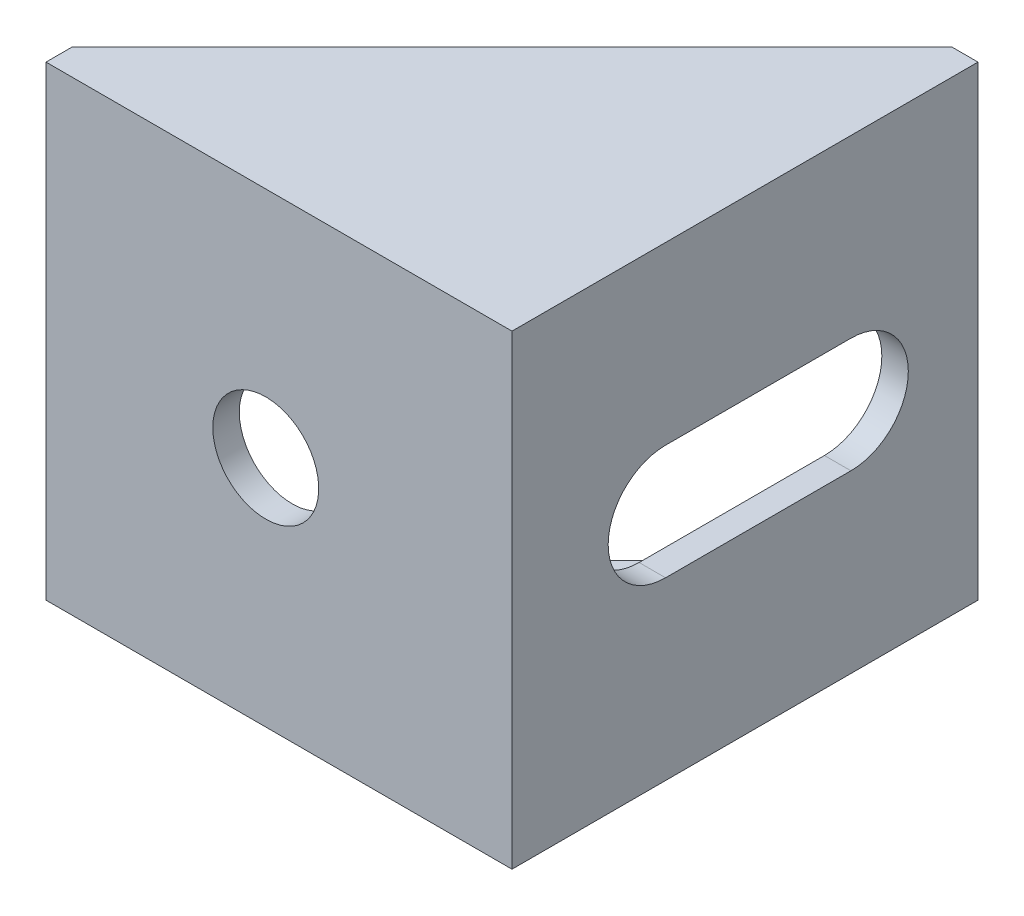
ISO-10303-21;
HEADER;
FILE_DESCRIPTION(('STEP AP214'),'2;1');
FILE_NAME('part.step','',(''),(''),'','','');
FILE_SCHEMA(('AUTOMOTIVE_DESIGN { 1 0 10303 214 1 1 1 1 }'));
ENDSEC;
DATA;
#1=APPLICATION_CONTEXT('core data for automotive mechanical design processes');
#2=APPLICATION_PROTOCOL_DEFINITION('international standard','automotive_design',2000,#1);
#3=PRODUCT_CONTEXT('',#1,'mechanical');
#4=PRODUCT('Part','Part','',(#3));
#5=PRODUCT_RELATED_PRODUCT_CATEGORY('part','',(#4));
#6=PRODUCT_DEFINITION_FORMATION('','',#4);
#7=PRODUCT_DEFINITION_CONTEXT('part definition',#1,'design');
#8=PRODUCT_DEFINITION('design','',#6,#7);
#9=PRODUCT_DEFINITION_SHAPE('','',#8);
#10=(LENGTH_UNIT() NAMED_UNIT(*) SI_UNIT(.MILLI.,.METRE.));
#11=(NAMED_UNIT(*) PLANE_ANGLE_UNIT() SI_UNIT($,.RADIAN.));
#12=(NAMED_UNIT(*) SI_UNIT($,.STERADIAN.) SOLID_ANGLE_UNIT());
#13=UNCERTAINTY_MEASURE_WITH_UNIT(LENGTH_MEASURE(1.E-05),#10,'distance_accuracy_value','');
#14=(GEOMETRIC_REPRESENTATION_CONTEXT(3) GLOBAL_UNCERTAINTY_ASSIGNED_CONTEXT((#13)) GLOBAL_UNIT_ASSIGNED_CONTEXT((#10,
#11,#12)) REPRESENTATION_CONTEXT('',''));
#15=CARTESIAN_POINT('',(0.,0.,0.));
#16=DIRECTION('',(0.,0.,1.));
#17=DIRECTION('',(1.,0.,0.));
#18=AXIS2_PLACEMENT_3D('',#15,#16,#17);
#19=CARTESIAN_POINT('',(0.,25.4,0.));
#20=DIRECTION('',(-1.,0.,0.));
#21=DIRECTION('',(0.,0.,1.));
#22=AXIS2_PLACEMENT_3D('',#19,#20,#21);
#23=PLANE('',#22);
#24=DIRECTION('',(0.,0.,-1.));
#25=VECTOR('',#24,1.);
#26=CARTESIAN_POINT('',(0.,16.1417,-20.32));
#27=LINE('',#26,#25);
#28=CARTESIAN_POINT('',(0.,16.1417,-9.2075));
#29=VERTEX_POINT('',#28);
#30=CARTESIAN_POINT('',(0.,16.1417,-20.32));
#31=VERTEX_POINT('',#30);
#32=EDGE_CURVE('E128',#29,#31,#27,.T.);
#33=ORIENTED_EDGE('',*,*,#32,.T.);
#34=CARTESIAN_POINT('',(0.,12.7,-20.32));
#35=DIRECTION('',(-1.,0.,0.));
#36=DIRECTION('',(0.,0.,-1.));
#37=AXIS2_PLACEMENT_3D('',#34,#35,#36);
#38=CIRCLE('',#37,3.4417);
#39=CARTESIAN_POINT('',(0.,9.2583,-20.32));
#40=VERTEX_POINT('',#39);
#41=EDGE_CURVE('E122',#31,#40,#38,.T.);
#42=ORIENTED_EDGE('',*,*,#41,.T.);
#43=DIRECTION('',(0.,0.,1.));
#44=VECTOR('',#43,1.);
#45=CARTESIAN_POINT('',(0.,9.2583,-20.32));
#46=LINE('',#45,#44);
#47=CARTESIAN_POINT('',(0.,9.2583,-9.2075));
#48=VERTEX_POINT('',#47);
#49=EDGE_CURVE('E131',#40,#48,#46,.T.);
#50=ORIENTED_EDGE('',*,*,#49,.T.);
#51=CARTESIAN_POINT('',(0.,12.7,-9.2075));
#52=DIRECTION('',(-1.,0.,0.));
#53=DIRECTION('',(0.,0.,1.));
#54=AXIS2_PLACEMENT_3D('',#51,#52,#53);
#55=CIRCLE('',#54,3.4417);
#56=EDGE_CURVE('E47',#48,#29,#55,.T.);
#57=ORIENTED_EDGE('',*,*,#56,.T.);
#58=EDGE_LOOP('',(#33,#42,#50,#57));
#59=FACE_BOUND('',#58,.T.);
#60=DIRECTION('',(0.,-1.,0.));
#61=VECTOR('',#60,1.);
#62=CARTESIAN_POINT('',(0.,25.4,0.));
#63=LINE('',#62,#61);
#64=CARTESIAN_POINT('',(0.,26.67,0.));
#65=VERTEX_POINT('',#64);
#66=CARTESIAN_POINT('',(0.,-1.27,0.));
#67=VERTEX_POINT('',#66);
#68=EDGE_CURVE('E213',#65,#67,#63,.T.);
#69=ORIENTED_EDGE('',*,*,#68,.T.);
#70=DIRECTION('',(0.,0.,1.));
#71=VECTOR('',#70,1.);
#72=CARTESIAN_POINT('',(0.,-1.27,-27.94));
#73=LINE('',#72,#71);
#74=CARTESIAN_POINT('',(0.,-1.27,-27.94));
#75=VERTEX_POINT('',#74);
#76=EDGE_CURVE('E168',#75,#67,#73,.T.);
#77=ORIENTED_EDGE('',*,*,#76,.F.);
#78=DIRECTION('',(0.,-1.,0.));
#79=VECTOR('',#78,1.);
#80=CARTESIAN_POINT('',(0.,25.4,-27.94));
#81=LINE('',#80,#79);
#82=CARTESIAN_POINT('',(0.,26.67,-27.94));
#83=VERTEX_POINT('',#82);
#84=EDGE_CURVE('E11',#83,#75,#81,.T.);
#85=ORIENTED_EDGE('',*,*,#84,.F.);
#86=DIRECTION('',(0.,0.,-1.));
#87=VECTOR('',#86,1.);
#88=CARTESIAN_POINT('',(0.,26.67,0.));
#89=LINE('',#88,#87);
#90=EDGE_CURVE('E194',#65,#83,#89,.T.);
#91=ORIENTED_EDGE('',*,*,#90,.F.);
#92=EDGE_LOOP('',(#69,#77,#85,#91));
#93=FACE_BOUND('',#92,.T.);
#94=ADVANCED_FACE('F33',(#59,#93),#23,.F.);
#95=CARTESIAN_POINT('',(0.,25.4,-27.94));
#96=DIRECTION('',(0.,0.,1.));
#97=DIRECTION('',(1.,0.,0.));
#98=AXIS2_PLACEMENT_3D('',#95,#96,#97);
#99=PLANE('',#98);
#100=ORIENTED_EDGE('',*,*,#84,.T.);
#101=DIRECTION('',(1.,0.,0.));
#102=VECTOR('',#101,1.);
#103=CARTESIAN_POINT('',(-1.5875,-1.27,-27.94));
#104=LINE('',#103,#102);
#105=CARTESIAN_POINT('',(-1.5875,-1.27,-27.94));
#106=VERTEX_POINT('',#105);
#107=EDGE_CURVE('E165',#106,#75,#104,.T.);
#108=ORIENTED_EDGE('',*,*,#107,.F.);
#109=DIRECTION('',(0.,1.,0.));
#110=VECTOR('',#109,1.);
#111=CARTESIAN_POINT('',(-1.5875,-1.27,-27.94));
#112=LINE('',#111,#110);
#113=CARTESIAN_POINT('',(-1.5875,0.,-27.94));
#114=VERTEX_POINT('',#113);
#115=EDGE_CURVE('E174',#106,#114,#112,.T.);
#116=ORIENTED_EDGE('',*,*,#115,.T.);
#117=DIRECTION('',(0.,-1.,0.));
#118=VECTOR('',#117,1.);
#119=CARTESIAN_POINT('',(-1.5875,25.4,-27.94));
#120=LINE('',#119,#118);
#121=CARTESIAN_POINT('',(-1.5875,25.4,-27.94));
#122=VERTEX_POINT('',#121);
#123=EDGE_CURVE('E40',#122,#114,#120,.T.);
#124=ORIENTED_EDGE('',*,*,#123,.F.);
#125=DIRECTION('',(0.,-1.,0.));
#126=VECTOR('',#125,1.);
#127=CARTESIAN_POINT('',(-1.5875,26.67,-27.94));
#128=LINE('',#127,#126);
#129=CARTESIAN_POINT('',(-1.5875,26.67,-27.94));
#130=VERTEX_POINT('',#129);
#131=EDGE_CURVE('E202',#130,#122,#128,.T.);
#132=ORIENTED_EDGE('',*,*,#131,.F.);
#133=DIRECTION('',(-1.,0.,0.));
#134=VECTOR('',#133,1.);
#135=CARTESIAN_POINT('',(0.,26.67,-27.94));
#136=LINE('',#135,#134);
#137=EDGE_CURVE('E183',#83,#130,#136,.T.);
#138=ORIENTED_EDGE('',*,*,#137,.F.);
#139=EDGE_LOOP('',(#100,#108,#116,#124,#132,#138));
#140=FACE_BOUND('',#139,.T.);
#141=ADVANCED_FACE('F240',(#140),#99,.F.);
#142=CARTESIAN_POINT('',(-1.5875,25.4,-1.5875));
#143=DIRECTION('',(-1.,0.,0.));
#144=DIRECTION('',(0.,0.,1.));
#145=AXIS2_PLACEMENT_3D('',#142,#143,#144);
#146=PLANE('',#145);
#147=CARTESIAN_POINT('',(-1.5875,12.7,-20.32));
#148=DIRECTION('',(-1.,0.,0.));
#149=DIRECTION('',(0.,0.,-1.));
#150=AXIS2_PLACEMENT_3D('',#147,#148,#149);
#151=CIRCLE('',#150,3.4417);
#152=CARTESIAN_POINT('',(-1.5875,16.1417,-20.32));
#153=VERTEX_POINT('',#152);
#154=CARTESIAN_POINT('',(-1.5875,9.2583,-20.32));
#155=VERTEX_POINT('',#154);
#156=EDGE_CURVE('E55',#153,#155,#151,.T.);
#157=ORIENTED_EDGE('',*,*,#156,.F.);
#158=DIRECTION('',(0.,0.,-1.));
#159=VECTOR('',#158,1.);
#160=CARTESIAN_POINT('',(-1.5875,16.1417,-20.32));
#161=LINE('',#160,#159);
#162=CARTESIAN_POINT('',(-1.5875,16.1417,-9.2075));
#163=VERTEX_POINT('',#162);
#164=EDGE_CURVE('E137',#163,#153,#161,.T.);
#165=ORIENTED_EDGE('',*,*,#164,.F.);
#166=CARTESIAN_POINT('',(-1.5875,12.7,-9.2075));
#167=DIRECTION('',(-1.,0.,0.));
#168=DIRECTION('',(0.,0.,1.));
#169=AXIS2_PLACEMENT_3D('',#166,#167,#168);
#170=CIRCLE('',#169,3.4417);
#171=CARTESIAN_POINT('',(-1.5875,9.2583,-9.2075));
#172=VERTEX_POINT('',#171);
#173=EDGE_CURVE('E140',#172,#163,#170,.T.);
#174=ORIENTED_EDGE('',*,*,#173,.F.);
#175=DIRECTION('',(0.,0.,1.));
#176=VECTOR('',#175,1.);
#177=CARTESIAN_POINT('',(-1.5875,9.2583,-20.32));
#178=LINE('',#177,#176);
#179=EDGE_CURVE('E149',#155,#172,#178,.T.);
#180=ORIENTED_EDGE('',*,*,#179,.F.);
#181=EDGE_LOOP('',(#157,#165,#174,#180));
#182=FACE_BOUND('',#181,.T.);
#183=DIRECTION('',(0.,0.,-1.));
#184=VECTOR('',#183,1.);
#185=CARTESIAN_POINT('',(-1.5875,0.,-1.5875));
#186=LINE('',#185,#184);
#187=CARTESIAN_POINT('',(-1.5875,0.,-1.5875));
#188=VERTEX_POINT('',#187);
#189=EDGE_CURVE('E205',#188,#114,#186,.T.);
#190=ORIENTED_EDGE('',*,*,#189,.F.);
#191=DIRECTION('',(0.,-1.,0.));
#192=VECTOR('',#191,1.);
#193=CARTESIAN_POINT('',(-1.5875,25.4,-1.5875));
#194=LINE('',#193,#192);
#195=CARTESIAN_POINT('',(-1.5875,25.4,-1.5875));
#196=VERTEX_POINT('',#195);
#197=EDGE_CURVE('E223',#196,#188,#194,.T.);
#198=ORIENTED_EDGE('',*,*,#197,.F.);
#199=DIRECTION('',(0.,0.,-1.));
#200=VECTOR('',#199,1.);
#201=CARTESIAN_POINT('',(-1.5875,25.4,-1.5875));
#202=LINE('',#201,#200);
#203=EDGE_CURVE('E206',#196,#122,#202,.T.);
#204=ORIENTED_EDGE('',*,*,#203,.T.);
#205=ORIENTED_EDGE('',*,*,#123,.T.);
#206=EDGE_LOOP('',(#190,#198,#204,#205));
#207=FACE_BOUND('',#206,.T.);
#208=ADVANCED_FACE('F227',(#182,#207),#146,.T.);
#209=CARTESIAN_POINT('',(-27.94,25.4,-1.5875));
#210=DIRECTION('',(0.,0.,-1.));
#211=DIRECTION('',(-1.,0.,0.));
#212=AXIS2_PLACEMENT_3D('',#209,#210,#211);
#213=PLANE('',#212);
#214=CARTESIAN_POINT('',(-14.76375,12.7,-1.5875));
#215=DIRECTION('',(0.,0.,-1.));
#216=DIRECTION('',(-1.,0.,0.));
#217=AXIS2_PLACEMENT_3D('',#214,#215,#216);
#218=CIRCLE('',#217,3.175);
#219=CARTESIAN_POINT('',(-17.93875,12.7,-1.5875));
#220=VERTEX_POINT('',#219);
#221=EDGE_CURVE('E143',#220,#220,#218,.T.);
#222=ORIENTED_EDGE('',*,*,#221,.F.);
#223=EDGE_LOOP('',(#222));
#224=FACE_BOUND('',#223,.T.);
#225=DIRECTION('',(1.,0.,0.));
#226=VECTOR('',#225,1.);
#227=CARTESIAN_POINT('',(-27.94,0.,-1.5875));
#228=LINE('',#227,#226);
#229=CARTESIAN_POINT('',(-27.94,0.,-1.5875));
#230=VERTEX_POINT('',#229);
#231=EDGE_CURVE('E210',#230,#188,#228,.T.);
#232=ORIENTED_EDGE('',*,*,#231,.F.);
#233=DIRECTION('',(0.,-1.,0.));
#234=VECTOR('',#233,1.);
#235=CARTESIAN_POINT('',(-27.94,25.4,-1.5875));
#236=LINE('',#235,#234);
#237=CARTESIAN_POINT('',(-27.94,25.4,-1.5875));
#238=VERTEX_POINT('',#237);
#239=EDGE_CURVE('E221',#238,#230,#236,.T.);
#240=ORIENTED_EDGE('',*,*,#239,.F.);
#241=DIRECTION('',(1.,0.,0.));
#242=VECTOR('',#241,1.);
#243=CARTESIAN_POINT('',(-27.94,25.4,-1.5875));
#244=LINE('',#243,#242);
#245=EDGE_CURVE('E209',#238,#196,#244,.T.);
#246=ORIENTED_EDGE('',*,*,#245,.T.);
#247=ORIENTED_EDGE('',*,*,#197,.T.);
#248=EDGE_LOOP('',(#232,#240,#246,#247));
#249=FACE_BOUND('',#248,.T.);
#250=ADVANCED_FACE('F259',(#224,#249),#213,.T.);
#251=CARTESIAN_POINT('',(-27.94,25.4,0.));
#252=DIRECTION('',(-1.,0.,0.));
#253=DIRECTION('',(0.,0.,1.));
#254=AXIS2_PLACEMENT_3D('',#251,#252,#253);
#255=PLANE('',#254);
#256=ORIENTED_EDGE('',*,*,#239,.T.);
#257=DIRECTION('',(0.,1.,0.));
#258=VECTOR('',#257,1.);
#259=CARTESIAN_POINT('',(-27.94,-1.27,-1.5875));
#260=LINE('',#259,#258);
#261=CARTESIAN_POINT('',(-27.94,-1.27,-1.5875));
#262=VERTEX_POINT('',#261);
#263=EDGE_CURVE('E179',#262,#230,#260,.T.);
#264=ORIENTED_EDGE('',*,*,#263,.F.);
#265=DIRECTION('',(0.,0.,-1.));
#266=VECTOR('',#265,1.);
#267=CARTESIAN_POINT('',(-27.94,-1.27,0.));
#268=LINE('',#267,#266);
#269=CARTESIAN_POINT('',(-27.94,-1.27,0.));
#270=VERTEX_POINT('',#269);
#271=EDGE_CURVE('E160',#270,#262,#268,.T.);
#272=ORIENTED_EDGE('',*,*,#271,.F.);
#273=DIRECTION('',(0.,-1.,0.));
#274=VECTOR('',#273,1.);
#275=CARTESIAN_POINT('',(-27.94,25.4,0.));
#276=LINE('',#275,#274);
#277=CARTESIAN_POINT('',(-27.94,26.67,0.));
#278=VERTEX_POINT('',#277);
#279=EDGE_CURVE('E219',#278,#270,#276,.T.);
#280=ORIENTED_EDGE('',*,*,#279,.F.);
#281=DIRECTION('',(0.,0.,1.));
#282=VECTOR('',#281,1.);
#283=CARTESIAN_POINT('',(-27.94,26.67,-1.5875));
#284=LINE('',#283,#282);
#285=CARTESIAN_POINT('',(-27.94,26.67,-1.5875));
#286=VERTEX_POINT('',#285);
#287=EDGE_CURVE('E188',#286,#278,#284,.T.);
#288=ORIENTED_EDGE('',*,*,#287,.F.);
#289=DIRECTION('',(0.,-1.,0.));
#290=VECTOR('',#289,1.);
#291=CARTESIAN_POINT('',(-27.94,26.67,-1.5875));
#292=LINE('',#291,#290);
#293=EDGE_CURVE('E197',#286,#238,#292,.T.);
#294=ORIENTED_EDGE('',*,*,#293,.T.);
#295=EDGE_LOOP('',(#256,#264,#272,#280,#288,#294));
#296=FACE_BOUND('',#295,.T.);
#297=ADVANCED_FACE('F255',(#296),#255,.T.);
#298=CARTESIAN_POINT('',(0.,25.4,0.));
#299=DIRECTION('',(0.,0.,1.));
#300=DIRECTION('',(1.,0.,0.));
#301=AXIS2_PLACEMENT_3D('',#298,#299,#300);
#302=PLANE('',#301);
#303=CARTESIAN_POINT('',(-14.76375,12.7,0.));
#304=DIRECTION('',(0.,0.,-1.));
#305=DIRECTION('',(-1.,0.,0.));
#306=AXIS2_PLACEMENT_3D('',#303,#304,#305);
#307=CIRCLE('',#306,3.175);
#308=CARTESIAN_POINT('',(-17.93875,12.7,0.));
#309=VERTEX_POINT('',#308);
#310=EDGE_CURVE('E150',#309,#309,#307,.T.);
#311=ORIENTED_EDGE('',*,*,#310,.T.);
#312=EDGE_LOOP('',(#311));
#313=FACE_BOUND('',#312,.T.);
#314=ORIENTED_EDGE('',*,*,#279,.T.);
#315=DIRECTION('',(-1.,0.,0.));
#316=VECTOR('',#315,1.);
#317=CARTESIAN_POINT('',(0.,-1.27,0.));
#318=LINE('',#317,#316);
#319=EDGE_CURVE('E171',#67,#270,#318,.T.);
#320=ORIENTED_EDGE('',*,*,#319,.F.);
#321=ORIENTED_EDGE('',*,*,#68,.F.);
#322=DIRECTION('',(1.,0.,0.));
#323=VECTOR('',#322,1.);
#324=CARTESIAN_POINT('',(-27.94,26.67,0.));
#325=LINE('',#324,#323);
#326=EDGE_CURVE('E191',#278,#65,#325,.T.);
#327=ORIENTED_EDGE('',*,*,#326,.F.);
#328=EDGE_LOOP('',(#314,#320,#321,#327));
#329=FACE_BOUND('',#328,.T.);
#330=ADVANCED_FACE('F249',(#313,#329),#302,.T.);
#331=CARTESIAN_POINT('',(-1.5875,26.67,-27.94));
#332=DIRECTION('',(0.707106781186548,0.,0.707106781186547));
#333=DIRECTION('',(0.707106781186547,0.,-0.707106781186548));
#334=AXIS2_PLACEMENT_3D('',#331,#332,#333);
#335=PLANE('',#334);
#336=DIRECTION('',(-0.707106781186547,0.,0.707106781186548));
#337=VECTOR('',#336,1.);
#338=CARTESIAN_POINT('',(-1.5875,25.4,-27.94));
#339=LINE('',#338,#337);
#340=EDGE_CURVE('E182',#122,#238,#339,.T.);
#341=ORIENTED_EDGE('',*,*,#340,.T.);
#342=ORIENTED_EDGE('',*,*,#293,.F.);
#343=DIRECTION('',(-0.707106781186547,0.,0.707106781186548));
#344=VECTOR('',#343,1.);
#345=CARTESIAN_POINT('',(-1.5875,26.67,-27.94));
#346=LINE('',#345,#344);
#347=EDGE_CURVE('E186',#130,#286,#346,.T.);
#348=ORIENTED_EDGE('',*,*,#347,.F.);
#349=ORIENTED_EDGE('',*,*,#131,.T.);
#350=EDGE_LOOP('',(#341,#342,#348,#349));
#351=FACE_BOUND('',#350,.T.);
#352=ADVANCED_FACE('F263',(#351),#335,.F.);
#353=CARTESIAN_POINT('',(0.,26.67,0.));
#354=DIRECTION('',(0.,1.,0.));
#355=DIRECTION('',(0.,0.,1.));
#356=AXIS2_PLACEMENT_3D('',#353,#354,#355);
#357=PLANE('',#356);
#358=ORIENTED_EDGE('',*,*,#137,.T.);
#359=ORIENTED_EDGE('',*,*,#347,.T.);
#360=ORIENTED_EDGE('',*,*,#287,.T.);
#361=ORIENTED_EDGE('',*,*,#326,.T.);
#362=ORIENTED_EDGE('',*,*,#90,.T.);
#363=EDGE_LOOP('',(#358,#359,#360,#361,#362));
#364=FACE_BOUND('',#363,.T.);
#365=ADVANCED_FACE('F251',(#364),#357,.T.);
#366=CARTESIAN_POINT('',(0.,25.4,0.));
#367=DIRECTION('',(0.,1.,0.));
#368=DIRECTION('',(0.,0.,1.));
#369=AXIS2_PLACEMENT_3D('',#366,#367,#368);
#370=PLANE('',#369);
#371=ORIENTED_EDGE('',*,*,#203,.F.);
#372=ORIENTED_EDGE('',*,*,#245,.F.);
#373=ORIENTED_EDGE('',*,*,#340,.F.);
#374=EDGE_LOOP('',(#371,#372,#373));
#375=FACE_BOUND('',#374,.T.);
#376=ADVANCED_FACE('F261',(#375),#370,.F.);
#377=CARTESIAN_POINT('',(0.,0.,0.));
#378=DIRECTION('',(0.,-1.,0.));
#379=DIRECTION('',(0.,0.,-1.));
#380=AXIS2_PLACEMENT_3D('',#377,#378,#379);
#381=PLANE('',#380);
#382=DIRECTION('',(0.707106781186547,0.,-0.707106781186548));
#383=VECTOR('',#382,1.);
#384=CARTESIAN_POINT('',(-27.94,0.,-1.5875));
#385=LINE('',#384,#383);
#386=EDGE_CURVE('E156',#230,#114,#385,.T.);
#387=ORIENTED_EDGE('',*,*,#386,.F.);
#388=ORIENTED_EDGE('',*,*,#231,.T.);
#389=ORIENTED_EDGE('',*,*,#189,.T.);
#390=EDGE_LOOP('',(#387,#388,#389));
#391=FACE_BOUND('',#390,.T.);
#392=ADVANCED_FACE('F233',(#391),#381,.F.);
#393=CARTESIAN_POINT('',(-27.94,-1.27,-1.5875));
#394=DIRECTION('',(0.707106781186548,0.,0.707106781186547));
#395=DIRECTION('',(0.707106781186547,0.,-0.707106781186548));
#396=AXIS2_PLACEMENT_3D('',#393,#394,#395);
#397=PLANE('',#396);
#398=ORIENTED_EDGE('',*,*,#386,.T.);
#399=ORIENTED_EDGE('',*,*,#115,.F.);
#400=DIRECTION('',(0.707106781186547,0.,-0.707106781186548));
#401=VECTOR('',#400,1.);
#402=CARTESIAN_POINT('',(-27.94,-1.27,-1.5875));
#403=LINE('',#402,#401);
#404=EDGE_CURVE('E163',#262,#106,#403,.T.);
#405=ORIENTED_EDGE('',*,*,#404,.F.);
#406=ORIENTED_EDGE('',*,*,#263,.T.);
#407=EDGE_LOOP('',(#398,#399,#405,#406));
#408=FACE_BOUND('',#407,.T.);
#409=ADVANCED_FACE('F237',(#408),#397,.F.);
#410=CARTESIAN_POINT('',(0.,-1.27,0.));
#411=DIRECTION('',(0.,-1.,0.));
#412=DIRECTION('',(0.,0.,-1.));
#413=AXIS2_PLACEMENT_3D('',#410,#411,#412);
#414=PLANE('',#413);
#415=ORIENTED_EDGE('',*,*,#271,.T.);
#416=ORIENTED_EDGE('',*,*,#404,.T.);
#417=ORIENTED_EDGE('',*,*,#107,.T.);
#418=ORIENTED_EDGE('',*,*,#76,.T.);
#419=ORIENTED_EDGE('',*,*,#319,.T.);
#420=EDGE_LOOP('',(#415,#416,#417,#418,#419));
#421=FACE_BOUND('',#420,.T.);
#422=ADVANCED_FACE('F244',(#421),#414,.T.);
#423=CARTESIAN_POINT('',(0.,12.7,-20.32));
#424=DIRECTION('',(-1.,0.,0.));
#425=DIRECTION('',(0.,0.,1.));
#426=AXIS2_PLACEMENT_3D('',#423,#424,#425);
#427=CYLINDRICAL_SURFACE('',#426,3.4417);
#428=ORIENTED_EDGE('',*,*,#156,.T.);
#429=DIRECTION('',(-1.,0.,0.));
#430=VECTOR('',#429,1.);
#431=CARTESIAN_POINT('',(0.,9.2583,-20.32));
#432=LINE('',#431,#430);
#433=EDGE_CURVE('E118',#40,#155,#432,.T.);
#434=ORIENTED_EDGE('',*,*,#433,.F.);
#435=ORIENTED_EDGE('',*,*,#41,.F.);
#436=DIRECTION('',(-1.,0.,0.));
#437=VECTOR('',#436,1.);
#438=CARTESIAN_POINT('',(0.,16.1417,-20.32));
#439=LINE('',#438,#437);
#440=EDGE_CURVE('E154',#31,#153,#439,.T.);
#441=ORIENTED_EDGE('',*,*,#440,.T.);
#442=EDGE_LOOP('',(#428,#434,#435,#441));
#443=FACE_BOUND('',#442,.T.);
#444=ADVANCED_FACE('F120',(#443),#427,.F.);
#445=CARTESIAN_POINT('',(0.,16.1417,-20.32));
#446=DIRECTION('',(0.,1.,0.));
#447=DIRECTION('',(0.,0.,1.));
#448=AXIS2_PLACEMENT_3D('',#445,#446,#447);
#449=PLANE('',#448);
#450=ORIENTED_EDGE('',*,*,#164,.T.);
#451=ORIENTED_EDGE('',*,*,#440,.F.);
#452=ORIENTED_EDGE('',*,*,#32,.F.);
#453=DIRECTION('',(-1.,0.,0.));
#454=VECTOR('',#453,1.);
#455=CARTESIAN_POINT('',(0.,16.1417,-9.2075));
#456=LINE('',#455,#454);
#457=EDGE_CURVE('E157',#29,#163,#456,.T.);
#458=ORIENTED_EDGE('',*,*,#457,.T.);
#459=EDGE_LOOP('',(#450,#451,#452,#458));
#460=FACE_BOUND('',#459,.T.);
#461=ADVANCED_FACE('F326',(#460),#449,.F.);
#462=CARTESIAN_POINT('',(0.,12.7,-9.2075));
#463=DIRECTION('',(-1.,0.,0.));
#464=DIRECTION('',(0.,0.,1.));
#465=AXIS2_PLACEMENT_3D('',#462,#463,#464);
#466=CYLINDRICAL_SURFACE('',#465,3.4417);
#467=ORIENTED_EDGE('',*,*,#173,.T.);
#468=ORIENTED_EDGE('',*,*,#457,.F.);
#469=ORIENTED_EDGE('',*,*,#56,.F.);
#470=DIRECTION('',(-1.,0.,0.));
#471=VECTOR('',#470,1.);
#472=CARTESIAN_POINT('',(0.,9.2583,-9.2075));
#473=LINE('',#472,#471);
#474=EDGE_CURVE('E127',#48,#172,#473,.T.);
#475=ORIENTED_EDGE('',*,*,#474,.T.);
#476=EDGE_LOOP('',(#467,#468,#469,#475));
#477=FACE_BOUND('',#476,.T.);
#478=ADVANCED_FACE('F320',(#477),#466,.F.);
#479=CARTESIAN_POINT('',(0.,9.2583,-20.32));
#480=DIRECTION('',(0.,-1.,0.));
#481=DIRECTION('',(0.,0.,-1.));
#482=AXIS2_PLACEMENT_3D('',#479,#480,#481);
#483=PLANE('',#482);
#484=ORIENTED_EDGE('',*,*,#179,.T.);
#485=ORIENTED_EDGE('',*,*,#474,.F.);
#486=ORIENTED_EDGE('',*,*,#49,.F.);
#487=ORIENTED_EDGE('',*,*,#433,.T.);
#488=EDGE_LOOP('',(#484,#485,#486,#487));
#489=FACE_BOUND('',#488,.T.);
#490=ADVANCED_FACE('F132',(#489),#483,.F.);
#491=CARTESIAN_POINT('',(-14.76375,12.7,0.));
#492=DIRECTION('',(0.,0.,-1.));
#493=DIRECTION('',(-1.,0.,0.));
#494=AXIS2_PLACEMENT_3D('',#491,#492,#493);
#495=CYLINDRICAL_SURFACE('',#494,3.175);
#496=ORIENTED_EDGE('',*,*,#310,.F.);
#497=EDGE_LOOP('',(#496));
#498=FACE_BOUND('',#497,.T.);
#499=ORIENTED_EDGE('',*,*,#221,.T.);
#500=EDGE_LOOP('',(#499));
#501=FACE_BOUND('',#500,.T.);
#502=ADVANCED_FACE('F307',(#498,#501),#495,.F.);
#503=CLOSED_SHELL('',(#94,#141,#208,#250,#297,#330,#352,#365,#376,#392,#409,#422,#444,#461,#478,
#490,#502));
#504=MANIFOLD_SOLID_BREP('B2',#503);
#505=ADVANCED_BREP_SHAPE_REPRESENTATION('',(#18,#504),#14);
#506=SHAPE_DEFINITION_REPRESENTATION(#9,#505);
ENDSEC;
END-ISO-10303-21;
